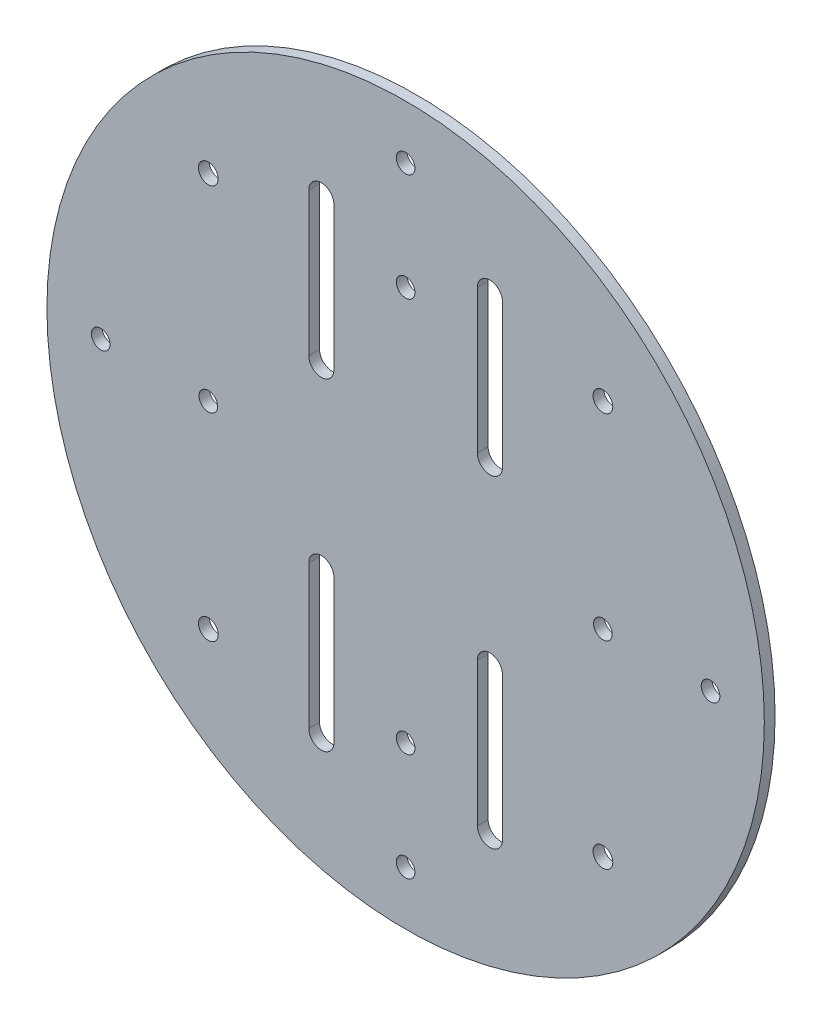
ISO-10303-21;
HEADER;
FILE_DESCRIPTION(('STEP AP214'),'2;1');
FILE_NAME('part.step','',(''),(''),'','','');
FILE_SCHEMA(('AUTOMOTIVE_DESIGN { 1 0 10303 214 1 1 1 1 }'));
ENDSEC;
DATA;
#1=APPLICATION_CONTEXT('core data for automotive mechanical design processes');
#2=APPLICATION_PROTOCOL_DEFINITION('international standard','automotive_design',2000,#1);
#3=PRODUCT_CONTEXT('',#1,'mechanical');
#4=PRODUCT('Part','Part','',(#3));
#5=PRODUCT_RELATED_PRODUCT_CATEGORY('part','',(#4));
#6=PRODUCT_DEFINITION_FORMATION('','',#4);
#7=PRODUCT_DEFINITION_CONTEXT('part definition',#1,'design');
#8=PRODUCT_DEFINITION('design','',#6,#7);
#9=PRODUCT_DEFINITION_SHAPE('','',#8);
#10=(LENGTH_UNIT() NAMED_UNIT(*) SI_UNIT(.MILLI.,.METRE.));
#11=(NAMED_UNIT(*) PLANE_ANGLE_UNIT() SI_UNIT($,.RADIAN.));
#12=(NAMED_UNIT(*) SI_UNIT($,.STERADIAN.) SOLID_ANGLE_UNIT());
#13=UNCERTAINTY_MEASURE_WITH_UNIT(LENGTH_MEASURE(1.E-05),#10,'distance_accuracy_value','');
#14=(GEOMETRIC_REPRESENTATION_CONTEXT(3) GLOBAL_UNCERTAINTY_ASSIGNED_CONTEXT((#13)) GLOBAL_UNIT_ASSIGNED_CONTEXT((#10,
#11,#12)) REPRESENTATION_CONTEXT('',''));
#15=CARTESIAN_POINT('',(0.,0.,0.));
#16=DIRECTION('',(0.,0.,1.));
#17=DIRECTION('',(1.,0.,0.));
#18=AXIS2_PLACEMENT_3D('',#15,#16,#17);
#19=CARTESIAN_POINT('',(0.,0.,30.));
#20=DIRECTION('',(0.,0.,-1.));
#21=DIRECTION('',(-1.,0.,0.));
#22=AXIS2_PLACEMENT_3D('',#19,#20,#21);
#23=CYLINDRICAL_SURFACE('',#22,100.);
#24=CARTESIAN_POINT('',(0.,0.,0.));
#25=DIRECTION('',(0.,0.,1.));
#26=DIRECTION('',(1.,0.,0.));
#27=AXIS2_PLACEMENT_3D('',#24,#25,#26);
#28=CIRCLE('',#27,100.);
#29=CARTESIAN_POINT('',(100.,0.,0.));
#30=VERTEX_POINT('',#29);
#31=EDGE_CURVE('E11',#30,#30,#28,.T.);
#32=ORIENTED_EDGE('',*,*,#31,.T.);
#33=EDGE_LOOP('',(#32));
#34=FACE_BOUND('',#33,.T.);
#35=CARTESIAN_POINT('',(0.,0.,3.));
#36=DIRECTION('',(0.,0.,1.));
#37=DIRECTION('',(1.,0.,0.));
#38=AXIS2_PLACEMENT_3D('',#35,#36,#37);
#39=CIRCLE('',#38,100.);
#40=CARTESIAN_POINT('',(100.,0.,3.));
#41=VERTEX_POINT('',#40);
#42=EDGE_CURVE('E290',#41,#41,#39,.T.);
#43=ORIENTED_EDGE('',*,*,#42,.F.);
#44=EDGE_LOOP('',(#43));
#45=FACE_BOUND('',#44,.T.);
#46=ADVANCED_FACE('F33',(#34,#45),#23,.T.);
#47=CARTESIAN_POINT('',(0.,-85.,30.));
#48=DIRECTION('',(0.,0.,1.));
#49=DIRECTION('',(1.,0.,0.));
#50=AXIS2_PLACEMENT_3D('',#47,#48,#49);
#51=CYLINDRICAL_SURFACE('',#50,2.59999999999999);
#52=CARTESIAN_POINT('',(0.,-85.,0.));
#53=DIRECTION('',(0.,0.,1.));
#54=DIRECTION('',(1.,0.,0.));
#55=AXIS2_PLACEMENT_3D('',#52,#53,#54);
#56=CIRCLE('',#55,2.6);
#57=CARTESIAN_POINT('',(2.6,-85.,0.));
#58=VERTEX_POINT('',#57);
#59=EDGE_CURVE('E41',#58,#58,#56,.T.);
#60=ORIENTED_EDGE('',*,*,#59,.F.);
#61=EDGE_LOOP('',(#60));
#62=FACE_BOUND('',#61,.T.);
#63=CARTESIAN_POINT('',(0.,-85.,3.));
#64=DIRECTION('',(0.,0.,1.));
#65=DIRECTION('',(1.,0.,0.));
#66=AXIS2_PLACEMENT_3D('',#63,#64,#65);
#67=CIRCLE('',#66,2.59999999999999);
#68=CARTESIAN_POINT('',(2.59999999999999,-85.,3.));
#69=VERTEX_POINT('',#68);
#70=EDGE_CURVE('E288',#69,#69,#67,.F.);
#71=ORIENTED_EDGE('',*,*,#70,.F.);
#72=EDGE_LOOP('',(#71));
#73=FACE_BOUND('',#72,.T.);
#74=ADVANCED_FACE('F281',(#62,#73),#51,.F.);
#75=CARTESIAN_POINT('',(0.,-55.,30.));
#76=DIRECTION('',(0.,0.,1.));
#77=DIRECTION('',(1.,0.,0.));
#78=AXIS2_PLACEMENT_3D('',#75,#76,#77);
#79=CYLINDRICAL_SURFACE('',#78,2.59999999999999);
#80=CARTESIAN_POINT('',(0.,-55.,0.));
#81=DIRECTION('',(0.,0.,1.));
#82=DIRECTION('',(1.,0.,0.));
#83=AXIS2_PLACEMENT_3D('',#80,#81,#82);
#84=CIRCLE('',#83,2.6);
#85=CARTESIAN_POINT('',(2.6,-55.,0.));
#86=VERTEX_POINT('',#85);
#87=EDGE_CURVE('E272',#86,#86,#84,.T.);
#88=ORIENTED_EDGE('',*,*,#87,.F.);
#89=EDGE_LOOP('',(#88));
#90=FACE_BOUND('',#89,.T.);
#91=CARTESIAN_POINT('',(0.,-55.,3.));
#92=DIRECTION('',(0.,0.,1.));
#93=DIRECTION('',(1.,0.,0.));
#94=AXIS2_PLACEMENT_3D('',#91,#92,#93);
#95=CIRCLE('',#94,2.59999999999999);
#96=CARTESIAN_POINT('',(2.59999999999999,-55.,3.));
#97=VERTEX_POINT('',#96);
#98=EDGE_CURVE('E291',#97,#97,#95,.F.);
#99=ORIENTED_EDGE('',*,*,#98,.F.);
#100=EDGE_LOOP('',(#99));
#101=FACE_BOUND('',#100,.T.);
#102=ADVANCED_FACE('F284',(#90,#101),#79,.F.);
#103=CARTESIAN_POINT('',(85.,0.,30.));
#104=DIRECTION('',(0.,0.,1.));
#105=DIRECTION('',(1.,0.,0.));
#106=AXIS2_PLACEMENT_3D('',#103,#104,#105);
#107=CYLINDRICAL_SURFACE('',#106,2.59999999999999);
#108=CARTESIAN_POINT('',(85.,0.,0.));
#109=DIRECTION('',(0.,0.,1.));
#110=DIRECTION('',(1.,0.,0.));
#111=AXIS2_PLACEMENT_3D('',#108,#109,#110);
#112=CIRCLE('',#111,2.59999999999999);
#113=CARTESIAN_POINT('',(87.6,0.,0.));
#114=VERTEX_POINT('',#113);
#115=EDGE_CURVE('E269',#114,#114,#112,.T.);
#116=ORIENTED_EDGE('',*,*,#115,.F.);
#117=EDGE_LOOP('',(#116));
#118=FACE_BOUND('',#117,.T.);
#119=CARTESIAN_POINT('',(85.,0.,3.));
#120=DIRECTION('',(0.,0.,1.));
#121=DIRECTION('',(1.,0.,0.));
#122=AXIS2_PLACEMENT_3D('',#119,#120,#121);
#123=CIRCLE('',#122,2.59999999999999);
#124=CARTESIAN_POINT('',(87.6,0.,3.));
#125=VERTEX_POINT('',#124);
#126=EDGE_CURVE('E297',#125,#125,#123,.F.);
#127=ORIENTED_EDGE('',*,*,#126,.F.);
#128=EDGE_LOOP('',(#127));
#129=FACE_BOUND('',#128,.T.);
#130=ADVANCED_FACE('F367',(#118,#129),#107,.F.);
#131=CARTESIAN_POINT('',(55.,0.,30.));
#132=DIRECTION('',(0.,0.,1.));
#133=DIRECTION('',(1.,0.,0.));
#134=AXIS2_PLACEMENT_3D('',#131,#132,#133);
#135=CYLINDRICAL_SURFACE('',#134,2.59999999999999);
#136=CARTESIAN_POINT('',(55.,0.,0.));
#137=DIRECTION('',(0.,0.,1.));
#138=DIRECTION('',(1.,0.,0.));
#139=AXIS2_PLACEMENT_3D('',#136,#137,#138);
#140=CIRCLE('',#139,2.6);
#141=CARTESIAN_POINT('',(57.6,0.,0.));
#142=VERTEX_POINT('',#141);
#143=EDGE_CURVE('E266',#142,#142,#140,.T.);
#144=ORIENTED_EDGE('',*,*,#143,.F.);
#145=EDGE_LOOP('',(#144));
#146=FACE_BOUND('',#145,.T.);
#147=CARTESIAN_POINT('',(55.,0.,3.));
#148=DIRECTION('',(0.,0.,1.));
#149=DIRECTION('',(1.,0.,0.));
#150=AXIS2_PLACEMENT_3D('',#147,#148,#149);
#151=CIRCLE('',#150,2.59999999999999);
#152=CARTESIAN_POINT('',(57.6,0.,3.));
#153=VERTEX_POINT('',#152);
#154=EDGE_CURVE('E360',#153,#153,#151,.F.);
#155=ORIENTED_EDGE('',*,*,#154,.F.);
#156=EDGE_LOOP('',(#155));
#157=FACE_BOUND('',#156,.T.);
#158=ADVANCED_FACE('F369',(#146,#157),#135,.F.);
#159=CARTESIAN_POINT('',(0.,85.,30.));
#160=DIRECTION('',(0.,0.,1.));
#161=DIRECTION('',(1.,0.,0.));
#162=AXIS2_PLACEMENT_3D('',#159,#160,#161);
#163=CYLINDRICAL_SURFACE('',#162,2.59999999999999);
#164=CARTESIAN_POINT('',(0.,85.,0.));
#165=DIRECTION('',(0.,0.,1.));
#166=DIRECTION('',(1.,0.,0.));
#167=AXIS2_PLACEMENT_3D('',#164,#165,#166);
#168=CIRCLE('',#167,2.6);
#169=CARTESIAN_POINT('',(2.6,85.,0.));
#170=VERTEX_POINT('',#169);
#171=EDGE_CURVE('E263',#170,#170,#168,.T.);
#172=ORIENTED_EDGE('',*,*,#171,.F.);
#173=EDGE_LOOP('',(#172));
#174=FACE_BOUND('',#173,.T.);
#175=CARTESIAN_POINT('',(0.,85.,3.));
#176=DIRECTION('',(0.,0.,1.));
#177=DIRECTION('',(1.,0.,0.));
#178=AXIS2_PLACEMENT_3D('',#175,#176,#177);
#179=CIRCLE('',#178,2.59999999999999);
#180=CARTESIAN_POINT('',(2.59999999999999,85.,3.));
#181=VERTEX_POINT('',#180);
#182=EDGE_CURVE('E357',#181,#181,#179,.F.);
#183=ORIENTED_EDGE('',*,*,#182,.F.);
#184=EDGE_LOOP('',(#183));
#185=FACE_BOUND('',#184,.T.);
#186=ADVANCED_FACE('F376',(#174,#185),#163,.F.);
#187=CARTESIAN_POINT('',(0.,55.,30.));
#188=DIRECTION('',(0.,0.,1.));
#189=DIRECTION('',(1.,0.,0.));
#190=AXIS2_PLACEMENT_3D('',#187,#188,#189);
#191=CYLINDRICAL_SURFACE('',#190,2.59999999999999);
#192=CARTESIAN_POINT('',(0.,55.,0.));
#193=DIRECTION('',(0.,0.,1.));
#194=DIRECTION('',(1.,0.,0.));
#195=AXIS2_PLACEMENT_3D('',#192,#193,#194);
#196=CIRCLE('',#195,2.6);
#197=CARTESIAN_POINT('',(2.6,55.,0.));
#198=VERTEX_POINT('',#197);
#199=EDGE_CURVE('E260',#198,#198,#196,.T.);
#200=ORIENTED_EDGE('',*,*,#199,.F.);
#201=EDGE_LOOP('',(#200));
#202=FACE_BOUND('',#201,.T.);
#203=CARTESIAN_POINT('',(0.,55.,3.));
#204=DIRECTION('',(0.,0.,1.));
#205=DIRECTION('',(1.,0.,0.));
#206=AXIS2_PLACEMENT_3D('',#203,#204,#205);
#207=CIRCLE('',#206,2.59999999999999);
#208=CARTESIAN_POINT('',(2.59999999999999,55.,3.));
#209=VERTEX_POINT('',#208);
#210=EDGE_CURVE('E354',#209,#209,#207,.F.);
#211=ORIENTED_EDGE('',*,*,#210,.F.);
#212=EDGE_LOOP('',(#211));
#213=FACE_BOUND('',#212,.T.);
#214=ADVANCED_FACE('F476',(#202,#213),#191,.F.);
#215=CARTESIAN_POINT('',(-55.,0.,30.));
#216=DIRECTION('',(0.,0.,1.));
#217=DIRECTION('',(1.,0.,0.));
#218=AXIS2_PLACEMENT_3D('',#215,#216,#217);
#219=CYLINDRICAL_SURFACE('',#218,2.59999999999999);
#220=CARTESIAN_POINT('',(-55.,0.,0.));
#221=DIRECTION('',(0.,0.,1.));
#222=DIRECTION('',(1.,0.,0.));
#223=AXIS2_PLACEMENT_3D('',#220,#221,#222);
#224=CIRCLE('',#223,2.6);
#225=CARTESIAN_POINT('',(-52.4,0.,0.));
#226=VERTEX_POINT('',#225);
#227=EDGE_CURVE('E257',#226,#226,#224,.T.);
#228=ORIENTED_EDGE('',*,*,#227,.F.);
#229=EDGE_LOOP('',(#228));
#230=FACE_BOUND('',#229,.T.);
#231=CARTESIAN_POINT('',(-55.,0.,3.));
#232=DIRECTION('',(0.,0.,1.));
#233=DIRECTION('',(1.,0.,0.));
#234=AXIS2_PLACEMENT_3D('',#231,#232,#233);
#235=CIRCLE('',#234,2.59999999999999);
#236=CARTESIAN_POINT('',(-52.4,0.,3.));
#237=VERTEX_POINT('',#236);
#238=EDGE_CURVE('E351',#237,#237,#235,.F.);
#239=ORIENTED_EDGE('',*,*,#238,.F.);
#240=EDGE_LOOP('',(#239));
#241=FACE_BOUND('',#240,.T.);
#242=ADVANCED_FACE('F472',(#230,#241),#219,.F.);
#243=CARTESIAN_POINT('',(-85.,0.,30.));
#244=DIRECTION('',(0.,0.,1.));
#245=DIRECTION('',(1.,0.,0.));
#246=AXIS2_PLACEMENT_3D('',#243,#244,#245);
#247=CYLINDRICAL_SURFACE('',#246,2.59999999999999);
#248=CARTESIAN_POINT('',(-85.,0.,0.));
#249=DIRECTION('',(0.,0.,1.));
#250=DIRECTION('',(1.,0.,0.));
#251=AXIS2_PLACEMENT_3D('',#248,#249,#250);
#252=CIRCLE('',#251,2.59999999999999);
#253=CARTESIAN_POINT('',(-82.4,0.,0.));
#254=VERTEX_POINT('',#253);
#255=EDGE_CURVE('E246',#254,#254,#252,.T.);
#256=ORIENTED_EDGE('',*,*,#255,.F.);
#257=EDGE_LOOP('',(#256));
#258=FACE_BOUND('',#257,.T.);
#259=CARTESIAN_POINT('',(-85.,0.,3.));
#260=DIRECTION('',(0.,0.,1.));
#261=DIRECTION('',(1.,0.,0.));
#262=AXIS2_PLACEMENT_3D('',#259,#260,#261);
#263=CIRCLE('',#262,2.59999999999999);
#264=CARTESIAN_POINT('',(-82.4,0.,3.));
#265=VERTEX_POINT('',#264);
#266=EDGE_CURVE('E348',#265,#265,#263,.F.);
#267=ORIENTED_EDGE('',*,*,#266,.F.);
#268=EDGE_LOOP('',(#267));
#269=FACE_BOUND('',#268,.T.);
#270=ADVANCED_FACE('F468',(#258,#269),#247,.F.);
#271=CARTESIAN_POINT('',(23.5,65.,0.));
#272=DIRECTION('',(0.,0.,1.));
#273=DIRECTION('',(1.,0.,0.));
#274=AXIS2_PLACEMENT_3D('',#271,#272,#273);
#275=CYLINDRICAL_SURFACE('',#274,3.5);
#276=CARTESIAN_POINT('',(23.5,65.,3.));
#277=DIRECTION('',(0.,0.,1.));
#278=DIRECTION('',(1.,0.,0.));
#279=AXIS2_PLACEMENT_3D('',#276,#277,#278);
#280=CIRCLE('',#279,3.5);
#281=CARTESIAN_POINT('',(20.,65.,3.));
#282=VERTEX_POINT('',#281);
#283=CARTESIAN_POINT('',(27.,65.,3.));
#284=VERTEX_POINT('',#283);
#285=EDGE_CURVE('E346',#282,#284,#280,.F.);
#286=ORIENTED_EDGE('',*,*,#285,.F.);
#287=DIRECTION('',(0.,0.,1.));
#288=VECTOR('',#287,1.);
#289=CARTESIAN_POINT('',(20.,65.,0.));
#290=LINE('',#289,#288);
#291=CARTESIAN_POINT('',(20.,65.,0.));
#292=VERTEX_POINT('',#291);
#293=EDGE_CURVE('E242',#292,#282,#290,.T.);
#294=ORIENTED_EDGE('',*,*,#293,.F.);
#295=CARTESIAN_POINT('',(23.5,65.,0.));
#296=DIRECTION('',(0.,0.,1.));
#297=DIRECTION('',(1.,0.,0.));
#298=AXIS2_PLACEMENT_3D('',#295,#296,#297);
#299=CIRCLE('',#298,3.5);
#300=CARTESIAN_POINT('',(27.,65.,0.));
#301=VERTEX_POINT('',#300);
#302=EDGE_CURVE('E222',#301,#292,#299,.T.);
#303=ORIENTED_EDGE('',*,*,#302,.F.);
#304=DIRECTION('',(0.,0.,1.));
#305=VECTOR('',#304,1.);
#306=CARTESIAN_POINT('',(27.,65.,0.));
#307=LINE('',#306,#305);
#308=EDGE_CURVE('E243',#301,#284,#307,.T.);
#309=ORIENTED_EDGE('',*,*,#308,.T.);
#310=EDGE_LOOP('',(#286,#294,#303,#309));
#311=FACE_BOUND('',#310,.T.);
#312=ADVANCED_FACE('F458',(#311),#275,.F.);
#313=CARTESIAN_POINT('',(27.,65.,0.));
#314=DIRECTION('',(1.,0.,0.));
#315=DIRECTION('',(0.,1.,0.));
#316=AXIS2_PLACEMENT_3D('',#313,#314,#315);
#317=PLANE('',#316);
#318=DIRECTION('',(0.,-1.,0.));
#319=VECTOR('',#318,1.);
#320=CARTESIAN_POINT('',(27.,65.,3.));
#321=LINE('',#320,#319);
#322=CARTESIAN_POINT('',(27.,25.,3.));
#323=VERTEX_POINT('',#322);
#324=EDGE_CURVE('E344',#284,#323,#321,.T.);
#325=ORIENTED_EDGE('',*,*,#324,.F.);
#326=ORIENTED_EDGE('',*,*,#308,.F.);
#327=DIRECTION('',(0.,1.,0.));
#328=VECTOR('',#327,1.);
#329=CARTESIAN_POINT('',(27.,65.,0.));
#330=LINE('',#329,#328);
#331=CARTESIAN_POINT('',(27.,25.,0.));
#332=VERTEX_POINT('',#331);
#333=EDGE_CURVE('E239',#332,#301,#330,.T.);
#334=ORIENTED_EDGE('',*,*,#333,.F.);
#335=DIRECTION('',(0.,0.,1.));
#336=VECTOR('',#335,1.);
#337=CARTESIAN_POINT('',(27.,25.,0.));
#338=LINE('',#337,#336);
#339=EDGE_CURVE('E247',#332,#323,#338,.T.);
#340=ORIENTED_EDGE('',*,*,#339,.T.);
#341=EDGE_LOOP('',(#325,#326,#334,#340));
#342=FACE_BOUND('',#341,.T.);
#343=ADVANCED_FACE('F454',(#342),#317,.F.);
#344=CARTESIAN_POINT('',(23.5,25.,0.));
#345=DIRECTION('',(0.,0.,1.));
#346=DIRECTION('',(1.,0.,0.));
#347=AXIS2_PLACEMENT_3D('',#344,#345,#346);
#348=CYLINDRICAL_SURFACE('',#347,3.5);
#349=CARTESIAN_POINT('',(23.5,25.,3.));
#350=DIRECTION('',(0.,0.,1.));
#351=DIRECTION('',(1.,0.,0.));
#352=AXIS2_PLACEMENT_3D('',#349,#350,#351);
#353=CIRCLE('',#352,3.5);
#354=CARTESIAN_POINT('',(20.,25.,3.));
#355=VERTEX_POINT('',#354);
#356=EDGE_CURVE('E48',#323,#355,#353,.F.);
#357=ORIENTED_EDGE('',*,*,#356,.F.);
#358=ORIENTED_EDGE('',*,*,#339,.F.);
#359=CARTESIAN_POINT('',(23.5,25.,0.));
#360=DIRECTION('',(0.,0.,1.));
#361=DIRECTION('',(1.,0.,0.));
#362=AXIS2_PLACEMENT_3D('',#359,#360,#361);
#363=CIRCLE('',#362,3.5);
#364=CARTESIAN_POINT('',(20.,25.,0.));
#365=VERTEX_POINT('',#364);
#366=EDGE_CURVE('E236',#365,#332,#363,.T.);
#367=ORIENTED_EDGE('',*,*,#366,.F.);
#368=DIRECTION('',(0.,0.,1.));
#369=VECTOR('',#368,1.);
#370=CARTESIAN_POINT('',(20.,25.,0.));
#371=LINE('',#370,#369);
#372=EDGE_CURVE('E250',#365,#355,#371,.T.);
#373=ORIENTED_EDGE('',*,*,#372,.T.);
#374=EDGE_LOOP('',(#357,#358,#367,#373));
#375=FACE_BOUND('',#374,.T.);
#376=ADVANCED_FACE('F457',(#375),#348,.F.);
#377=CARTESIAN_POINT('',(20.,65.,0.));
#378=DIRECTION('',(-1.,0.,0.));
#379=DIRECTION('',(0.,-1.,0.));
#380=AXIS2_PLACEMENT_3D('',#377,#378,#379);
#381=PLANE('',#380);
#382=DIRECTION('',(0.,1.,0.));
#383=VECTOR('',#382,1.);
#384=CARTESIAN_POINT('',(20.,65.,3.));
#385=LINE('',#384,#383);
#386=EDGE_CURVE('E341',#355,#282,#385,.T.);
#387=ORIENTED_EDGE('',*,*,#386,.F.);
#388=ORIENTED_EDGE('',*,*,#372,.F.);
#389=DIRECTION('',(0.,-1.,0.));
#390=VECTOR('',#389,1.);
#391=CARTESIAN_POINT('',(20.,65.,0.));
#392=LINE('',#391,#390);
#393=EDGE_CURVE('E233',#292,#365,#392,.T.);
#394=ORIENTED_EDGE('',*,*,#393,.F.);
#395=ORIENTED_EDGE('',*,*,#293,.T.);
#396=EDGE_LOOP('',(#387,#388,#394,#395));
#397=FACE_BOUND('',#396,.T.);
#398=ADVANCED_FACE('F452',(#397),#381,.F.);
#399=CARTESIAN_POINT('',(-23.5,65.,0.));
#400=DIRECTION('',(0.,0.,1.));
#401=DIRECTION('',(1.,0.,0.));
#402=AXIS2_PLACEMENT_3D('',#399,#400,#401);
#403=CYLINDRICAL_SURFACE('',#402,3.5);
#404=CARTESIAN_POINT('',(-23.5,65.,3.));
#405=DIRECTION('',(0.,0.,1.));
#406=DIRECTION('',(1.,0.,0.));
#407=AXIS2_PLACEMENT_3D('',#404,#405,#406);
#408=CIRCLE('',#407,3.5);
#409=CARTESIAN_POINT('',(-27.,65.,3.));
#410=VERTEX_POINT('',#409);
#411=CARTESIAN_POINT('',(-20.,65.,3.));
#412=VERTEX_POINT('',#411);
#413=EDGE_CURVE('E339',#410,#412,#408,.F.);
#414=ORIENTED_EDGE('',*,*,#413,.F.);
#415=DIRECTION('',(0.,0.,1.));
#416=VECTOR('',#415,1.);
#417=CARTESIAN_POINT('',(-27.,65.,0.));
#418=LINE('',#417,#416);
#419=CARTESIAN_POINT('',(-27.,65.,0.));
#420=VERTEX_POINT('',#419);
#421=EDGE_CURVE('E218',#420,#410,#418,.T.);
#422=ORIENTED_EDGE('',*,*,#421,.F.);
#423=CARTESIAN_POINT('',(-23.5,65.,0.));
#424=DIRECTION('',(0.,0.,1.));
#425=DIRECTION('',(1.,0.,0.));
#426=AXIS2_PLACEMENT_3D('',#423,#424,#425);
#427=CIRCLE('',#426,3.5);
#428=CARTESIAN_POINT('',(-20.,65.,0.));
#429=VERTEX_POINT('',#428);
#430=EDGE_CURVE('E198',#429,#420,#427,.T.);
#431=ORIENTED_EDGE('',*,*,#430,.F.);
#432=DIRECTION('',(0.,0.,1.));
#433=VECTOR('',#432,1.);
#434=CARTESIAN_POINT('',(-20.,65.,0.));
#435=LINE('',#434,#433);
#436=EDGE_CURVE('E219',#429,#412,#435,.T.);
#437=ORIENTED_EDGE('',*,*,#436,.T.);
#438=EDGE_LOOP('',(#414,#422,#431,#437));
#439=FACE_BOUND('',#438,.T.);
#440=ADVANCED_FACE('F442',(#439),#403,.F.);
#441=CARTESIAN_POINT('',(-20.,65.,0.));
#442=DIRECTION('',(1.,0.,0.));
#443=DIRECTION('',(0.,1.,0.));
#444=AXIS2_PLACEMENT_3D('',#441,#442,#443);
#445=PLANE('',#444);
#446=DIRECTION('',(0.,-1.,0.));
#447=VECTOR('',#446,1.);
#448=CARTESIAN_POINT('',(-20.,65.,3.));
#449=LINE('',#448,#447);
#450=CARTESIAN_POINT('',(-20.,25.,3.));
#451=VERTEX_POINT('',#450);
#452=EDGE_CURVE('E337',#412,#451,#449,.T.);
#453=ORIENTED_EDGE('',*,*,#452,.F.);
#454=ORIENTED_EDGE('',*,*,#436,.F.);
#455=DIRECTION('',(0.,1.,0.));
#456=VECTOR('',#455,1.);
#457=CARTESIAN_POINT('',(-20.,65.,0.));
#458=LINE('',#457,#456);
#459=CARTESIAN_POINT('',(-20.,25.,0.));
#460=VERTEX_POINT('',#459);
#461=EDGE_CURVE('E215',#460,#429,#458,.T.);
#462=ORIENTED_EDGE('',*,*,#461,.F.);
#463=DIRECTION('',(0.,0.,1.));
#464=VECTOR('',#463,1.);
#465=CARTESIAN_POINT('',(-20.,25.,0.));
#466=LINE('',#465,#464);
#467=EDGE_CURVE('E223',#460,#451,#466,.T.);
#468=ORIENTED_EDGE('',*,*,#467,.T.);
#469=EDGE_LOOP('',(#453,#454,#462,#468));
#470=FACE_BOUND('',#469,.T.);
#471=ADVANCED_FACE('F438',(#470),#445,.F.);
#472=CARTESIAN_POINT('',(-23.5,25.,0.));
#473=DIRECTION('',(0.,0.,1.));
#474=DIRECTION('',(1.,0.,0.));
#475=AXIS2_PLACEMENT_3D('',#472,#473,#474);
#476=CYLINDRICAL_SURFACE('',#475,3.5);
#477=CARTESIAN_POINT('',(-23.5,25.,3.));
#478=DIRECTION('',(0.,0.,1.));
#479=DIRECTION('',(1.,0.,0.));
#480=AXIS2_PLACEMENT_3D('',#477,#478,#479);
#481=CIRCLE('',#480,3.5);
#482=CARTESIAN_POINT('',(-27.,25.,3.));
#483=VERTEX_POINT('',#482);
#484=EDGE_CURVE('E56',#451,#483,#481,.F.);
#485=ORIENTED_EDGE('',*,*,#484,.F.);
#486=ORIENTED_EDGE('',*,*,#467,.F.);
#487=CARTESIAN_POINT('',(-23.5,25.,0.));
#488=DIRECTION('',(0.,0.,1.));
#489=DIRECTION('',(1.,0.,0.));
#490=AXIS2_PLACEMENT_3D('',#487,#488,#489);
#491=CIRCLE('',#490,3.5);
#492=CARTESIAN_POINT('',(-27.,25.,0.));
#493=VERTEX_POINT('',#492);
#494=EDGE_CURVE('E212',#493,#460,#491,.T.);
#495=ORIENTED_EDGE('',*,*,#494,.F.);
#496=DIRECTION('',(0.,0.,1.));
#497=VECTOR('',#496,1.);
#498=CARTESIAN_POINT('',(-27.,25.,0.));
#499=LINE('',#498,#497);
#500=EDGE_CURVE('E226',#493,#483,#499,.T.);
#501=ORIENTED_EDGE('',*,*,#500,.T.);
#502=EDGE_LOOP('',(#485,#486,#495,#501));
#503=FACE_BOUND('',#502,.T.);
#504=ADVANCED_FACE('F441',(#503),#476,.F.);
#505=CARTESIAN_POINT('',(-27.,65.,0.));
#506=DIRECTION('',(-1.,0.,0.));
#507=DIRECTION('',(0.,-1.,0.));
#508=AXIS2_PLACEMENT_3D('',#505,#506,#507);
#509=PLANE('',#508);
#510=DIRECTION('',(0.,1.,0.));
#511=VECTOR('',#510,1.);
#512=CARTESIAN_POINT('',(-27.,65.,3.));
#513=LINE('',#512,#511);
#514=EDGE_CURVE('E334',#483,#410,#513,.T.);
#515=ORIENTED_EDGE('',*,*,#514,.F.);
#516=ORIENTED_EDGE('',*,*,#500,.F.);
#517=DIRECTION('',(0.,-1.,0.));
#518=VECTOR('',#517,1.);
#519=CARTESIAN_POINT('',(-27.,65.,0.));
#520=LINE('',#519,#518);
#521=EDGE_CURVE('E209',#420,#493,#520,.T.);
#522=ORIENTED_EDGE('',*,*,#521,.F.);
#523=ORIENTED_EDGE('',*,*,#421,.T.);
#524=EDGE_LOOP('',(#515,#516,#522,#523));
#525=FACE_BOUND('',#524,.T.);
#526=ADVANCED_FACE('F436',(#525),#509,.F.);
#527=CARTESIAN_POINT('',(-23.5,-25.,0.));
#528=DIRECTION('',(0.,0.,1.));
#529=DIRECTION('',(1.,0.,0.));
#530=AXIS2_PLACEMENT_3D('',#527,#528,#529);
#531=CYLINDRICAL_SURFACE('',#530,3.5);
#532=CARTESIAN_POINT('',(-23.5,-25.,3.));
#533=DIRECTION('',(0.,0.,1.));
#534=DIRECTION('',(1.,0.,0.));
#535=AXIS2_PLACEMENT_3D('',#532,#533,#534);
#536=CIRCLE('',#535,3.5);
#537=CARTESIAN_POINT('',(-27.,-25.,3.));
#538=VERTEX_POINT('',#537);
#539=CARTESIAN_POINT('',(-20.,-25.,3.));
#540=VERTEX_POINT('',#539);
#541=EDGE_CURVE('E332',#538,#540,#536,.F.);
#542=ORIENTED_EDGE('',*,*,#541,.F.);
#543=DIRECTION('',(0.,0.,1.));
#544=VECTOR('',#543,1.);
#545=CARTESIAN_POINT('',(-27.,-25.,0.));
#546=LINE('',#545,#544);
#547=CARTESIAN_POINT('',(-27.,-25.,0.));
#548=VERTEX_POINT('',#547);
#549=EDGE_CURVE('E194',#548,#538,#546,.T.);
#550=ORIENTED_EDGE('',*,*,#549,.F.);
#551=CARTESIAN_POINT('',(-23.5,-25.,0.));
#552=DIRECTION('',(0.,0.,1.));
#553=DIRECTION('',(1.,0.,0.));
#554=AXIS2_PLACEMENT_3D('',#551,#552,#553);
#555=CIRCLE('',#554,3.5);
#556=CARTESIAN_POINT('',(-20.,-25.,0.));
#557=VERTEX_POINT('',#556);
#558=EDGE_CURVE('E182',#557,#548,#555,.T.);
#559=ORIENTED_EDGE('',*,*,#558,.F.);
#560=DIRECTION('',(0.,0.,1.));
#561=VECTOR('',#560,1.);
#562=CARTESIAN_POINT('',(-20.,-25.,0.));
#563=LINE('',#562,#561);
#564=EDGE_CURVE('E195',#557,#540,#563,.T.);
#565=ORIENTED_EDGE('',*,*,#564,.T.);
#566=EDGE_LOOP('',(#542,#550,#559,#565));
#567=FACE_BOUND('',#566,.T.);
#568=ADVANCED_FACE('F426',(#567),#531,.F.);
#569=CARTESIAN_POINT('',(-20.,-25.,0.));
#570=DIRECTION('',(1.,0.,0.));
#571=DIRECTION('',(0.,1.,0.));
#572=AXIS2_PLACEMENT_3D('',#569,#570,#571);
#573=PLANE('',#572);
#574=DIRECTION('',(0.,-1.,0.));
#575=VECTOR('',#574,1.);
#576=CARTESIAN_POINT('',(-20.,-25.,3.));
#577=LINE('',#576,#575);
#578=CARTESIAN_POINT('',(-20.,-65.,3.));
#579=VERTEX_POINT('',#578);
#580=EDGE_CURVE('E330',#540,#579,#577,.T.);
#581=ORIENTED_EDGE('',*,*,#580,.F.);
#582=ORIENTED_EDGE('',*,*,#564,.F.);
#583=DIRECTION('',(0.,1.,0.));
#584=VECTOR('',#583,1.);
#585=CARTESIAN_POINT('',(-20.,-25.,0.));
#586=LINE('',#585,#584);
#587=CARTESIAN_POINT('',(-20.,-65.,0.));
#588=VERTEX_POINT('',#587);
#589=EDGE_CURVE('E191',#588,#557,#586,.T.);
#590=ORIENTED_EDGE('',*,*,#589,.F.);
#591=DIRECTION('',(0.,0.,1.));
#592=VECTOR('',#591,1.);
#593=CARTESIAN_POINT('',(-20.,-65.,0.));
#594=LINE('',#593,#592);
#595=EDGE_CURVE('E199',#588,#579,#594,.T.);
#596=ORIENTED_EDGE('',*,*,#595,.T.);
#597=EDGE_LOOP('',(#581,#582,#590,#596));
#598=FACE_BOUND('',#597,.T.);
#599=ADVANCED_FACE('F422',(#598),#573,.F.);
#600=CARTESIAN_POINT('',(-23.5,-65.,0.));
#601=DIRECTION('',(0.,0.,1.));
#602=DIRECTION('',(1.,0.,0.));
#603=AXIS2_PLACEMENT_3D('',#600,#601,#602);
#604=CYLINDRICAL_SURFACE('',#603,3.5);
#605=CARTESIAN_POINT('',(-23.5,-65.,3.));
#606=DIRECTION('',(0.,0.,1.));
#607=DIRECTION('',(1.,0.,0.));
#608=AXIS2_PLACEMENT_3D('',#605,#606,#607);
#609=CIRCLE('',#608,3.5);
#610=CARTESIAN_POINT('',(-27.,-65.,3.));
#611=VERTEX_POINT('',#610);
#612=EDGE_CURVE('E328',#579,#611,#609,.F.);
#613=ORIENTED_EDGE('',*,*,#612,.F.);
#614=ORIENTED_EDGE('',*,*,#595,.F.);
#615=CARTESIAN_POINT('',(-23.5,-65.,0.));
#616=DIRECTION('',(0.,0.,1.));
#617=DIRECTION('',(1.,0.,0.));
#618=AXIS2_PLACEMENT_3D('',#615,#616,#617);
#619=CIRCLE('',#618,3.5);
#620=CARTESIAN_POINT('',(-27.,-65.,0.));
#621=VERTEX_POINT('',#620);
#622=EDGE_CURVE('E188',#621,#588,#619,.T.);
#623=ORIENTED_EDGE('',*,*,#622,.F.);
#624=DIRECTION('',(0.,0.,1.));
#625=VECTOR('',#624,1.);
#626=CARTESIAN_POINT('',(-27.,-65.,0.));
#627=LINE('',#626,#625);
#628=EDGE_CURVE('E202',#621,#611,#627,.T.);
#629=ORIENTED_EDGE('',*,*,#628,.T.);
#630=EDGE_LOOP('',(#613,#614,#623,#629));
#631=FACE_BOUND('',#630,.T.);
#632=ADVANCED_FACE('F425',(#631),#604,.F.);
#633=CARTESIAN_POINT('',(-27.,-25.,0.));
#634=DIRECTION('',(-1.,0.,0.));
#635=DIRECTION('',(0.,-1.,0.));
#636=AXIS2_PLACEMENT_3D('',#633,#634,#635);
#637=PLANE('',#636);
#638=DIRECTION('',(0.,1.,0.));
#639=VECTOR('',#638,1.);
#640=CARTESIAN_POINT('',(-27.,-25.,3.));
#641=LINE('',#640,#639);
#642=EDGE_CURVE('E165',#611,#538,#641,.T.);
#643=ORIENTED_EDGE('',*,*,#642,.F.);
#644=ORIENTED_EDGE('',*,*,#628,.F.);
#645=DIRECTION('',(0.,-1.,0.));
#646=VECTOR('',#645,1.);
#647=CARTESIAN_POINT('',(-27.,-25.,0.));
#648=LINE('',#647,#646);
#649=EDGE_CURVE('E185',#548,#621,#648,.T.);
#650=ORIENTED_EDGE('',*,*,#649,.F.);
#651=ORIENTED_EDGE('',*,*,#549,.T.);
#652=EDGE_LOOP('',(#643,#644,#650,#651));
#653=FACE_BOUND('',#652,.T.);
#654=ADVANCED_FACE('F421',(#653),#637,.F.);
#655=CARTESIAN_POINT('',(23.5,-65.,0.));
#656=DIRECTION('',(0.,0.,1.));
#657=DIRECTION('',(1.,0.,0.));
#658=AXIS2_PLACEMENT_3D('',#655,#656,#657);
#659=CYLINDRICAL_SURFACE('',#658,3.50000000000001);
#660=CARTESIAN_POINT('',(23.5,-65.,3.));
#661=DIRECTION('',(0.,0.,1.));
#662=DIRECTION('',(1.,0.,0.));
#663=AXIS2_PLACEMENT_3D('',#660,#661,#662);
#664=CIRCLE('',#663,3.50000000000001);
#665=CARTESIAN_POINT('',(27.,-65.,3.));
#666=VERTEX_POINT('',#665);
#667=CARTESIAN_POINT('',(20.,-65.,3.));
#668=VERTEX_POINT('',#667);
#669=EDGE_CURVE('E148',#666,#668,#664,.F.);
#670=ORIENTED_EDGE('',*,*,#669,.F.);
#671=DIRECTION('',(0.,0.,1.));
#672=VECTOR('',#671,1.);
#673=CARTESIAN_POINT('',(27.,-65.,0.));
#674=LINE('',#673,#672);
#675=CARTESIAN_POINT('',(27.,-65.,0.));
#676=VERTEX_POINT('',#675);
#677=EDGE_CURVE('E162',#676,#666,#674,.T.);
#678=ORIENTED_EDGE('',*,*,#677,.F.);
#679=CARTESIAN_POINT('',(23.5,-65.,0.));
#680=DIRECTION('',(0.,0.,1.));
#681=DIRECTION('',(1.,0.,0.));
#682=AXIS2_PLACEMENT_3D('',#679,#680,#681);
#683=CIRCLE('',#682,3.50000000000001);
#684=CARTESIAN_POINT('',(20.,-65.,0.));
#685=VERTEX_POINT('',#684);
#686=EDGE_CURVE('E312',#685,#676,#683,.T.);
#687=ORIENTED_EDGE('',*,*,#686,.F.);
#688=DIRECTION('',(0.,0.,1.));
#689=VECTOR('',#688,1.);
#690=CARTESIAN_POINT('',(20.,-65.,0.));
#691=LINE('',#690,#689);
#692=EDGE_CURVE('E164',#685,#668,#691,.T.);
#693=ORIENTED_EDGE('',*,*,#692,.T.);
#694=EDGE_LOOP('',(#670,#678,#687,#693));
#695=FACE_BOUND('',#694,.T.);
#696=ADVANCED_FACE('F160',(#695),#659,.F.);
#697=CARTESIAN_POINT('',(20.,-65.,0.));
#698=DIRECTION('',(-1.,0.,0.));
#699=DIRECTION('',(0.,-1.,0.));
#700=AXIS2_PLACEMENT_3D('',#697,#698,#699);
#701=PLANE('',#700);
#702=DIRECTION('',(0.,1.,0.));
#703=VECTOR('',#702,1.);
#704=CARTESIAN_POINT('',(20.,-65.,3.));
#705=LINE('',#704,#703);
#706=CARTESIAN_POINT('',(20.,-25.,3.));
#707=VERTEX_POINT('',#706);
#708=EDGE_CURVE('E166',#668,#707,#705,.T.);
#709=ORIENTED_EDGE('',*,*,#708,.F.);
#710=ORIENTED_EDGE('',*,*,#692,.F.);
#711=DIRECTION('',(0.,-1.,0.));
#712=VECTOR('',#711,1.);
#713=CARTESIAN_POINT('',(20.,-65.,0.));
#714=LINE('',#713,#712);
#715=CARTESIAN_POINT('',(20.,-25.,0.));
#716=VERTEX_POINT('',#715);
#717=EDGE_CURVE('E173',#716,#685,#714,.T.);
#718=ORIENTED_EDGE('',*,*,#717,.F.);
#719=DIRECTION('',(0.,0.,1.));
#720=VECTOR('',#719,1.);
#721=CARTESIAN_POINT('',(20.,-25.,0.));
#722=LINE('',#721,#720);
#723=EDGE_CURVE('E175',#716,#707,#722,.T.);
#724=ORIENTED_EDGE('',*,*,#723,.T.);
#725=EDGE_LOOP('',(#709,#710,#718,#724));
#726=FACE_BOUND('',#725,.T.);
#727=ADVANCED_FACE('F320',(#726),#701,.F.);
#728=CARTESIAN_POINT('',(23.5,-25.,0.));
#729=DIRECTION('',(0.,0.,1.));
#730=DIRECTION('',(1.,0.,0.));
#731=AXIS2_PLACEMENT_3D('',#728,#729,#730);
#732=CYLINDRICAL_SURFACE('',#731,3.50000000000001);
#733=CARTESIAN_POINT('',(23.5,-25.,3.));
#734=DIRECTION('',(0.,0.,1.));
#735=DIRECTION('',(1.,0.,0.));
#736=AXIS2_PLACEMENT_3D('',#733,#734,#735);
#737=CIRCLE('',#736,3.50000000000001);
#738=CARTESIAN_POINT('',(27.,-25.,3.));
#739=VERTEX_POINT('',#738);
#740=EDGE_CURVE('E151',#707,#739,#737,.F.);
#741=ORIENTED_EDGE('',*,*,#740,.F.);
#742=ORIENTED_EDGE('',*,*,#723,.F.);
#743=CARTESIAN_POINT('',(23.5,-25.,0.));
#744=DIRECTION('',(0.,0.,1.));
#745=DIRECTION('',(1.,0.,0.));
#746=AXIS2_PLACEMENT_3D('',#743,#744,#745);
#747=CIRCLE('',#746,3.50000000000001);
#748=CARTESIAN_POINT('',(27.,-25.,0.));
#749=VERTEX_POINT('',#748);
#750=EDGE_CURVE('E178',#749,#716,#747,.T.);
#751=ORIENTED_EDGE('',*,*,#750,.F.);
#752=DIRECTION('',(0.,0.,1.));
#753=VECTOR('',#752,1.);
#754=CARTESIAN_POINT('',(27.,-25.,0.));
#755=LINE('',#754,#753);
#756=EDGE_CURVE('E172',#749,#739,#755,.T.);
#757=ORIENTED_EDGE('',*,*,#756,.T.);
#758=EDGE_LOOP('',(#741,#742,#751,#757));
#759=FACE_BOUND('',#758,.T.);
#760=ADVANCED_FACE('F322',(#759),#732,.F.);
#761=CARTESIAN_POINT('',(27.,-65.,0.));
#762=DIRECTION('',(1.,0.,0.));
#763=DIRECTION('',(0.,1.,0.));
#764=AXIS2_PLACEMENT_3D('',#761,#762,#763);
#765=PLANE('',#764);
#766=DIRECTION('',(0.,-1.,0.));
#767=VECTOR('',#766,1.);
#768=CARTESIAN_POINT('',(27.,-65.,3.));
#769=LINE('',#768,#767);
#770=EDGE_CURVE('E145',#739,#666,#769,.T.);
#771=ORIENTED_EDGE('',*,*,#770,.F.);
#772=ORIENTED_EDGE('',*,*,#756,.F.);
#773=DIRECTION('',(0.,1.,0.));
#774=VECTOR('',#773,1.);
#775=CARTESIAN_POINT('',(27.,-65.,0.));
#776=LINE('',#775,#774);
#777=EDGE_CURVE('E170',#676,#749,#776,.T.);
#778=ORIENTED_EDGE('',*,*,#777,.F.);
#779=ORIENTED_EDGE('',*,*,#677,.T.);
#780=EDGE_LOOP('',(#771,#772,#778,#779));
#781=FACE_BOUND('',#780,.T.);
#782=ADVANCED_FACE('F168',(#781),#765,.F.);
#783=CARTESIAN_POINT('',(-55.,-55.,30.));
#784=DIRECTION('',(0.,0.,1.));
#785=DIRECTION('',(1.,0.,0.));
#786=AXIS2_PLACEMENT_3D('',#783,#784,#785);
#787=CYLINDRICAL_SURFACE('',#786,2.74999999999999);
#788=CARTESIAN_POINT('',(-55.,-55.,0.));
#789=DIRECTION('',(0.,0.,1.));
#790=DIRECTION('',(1.,0.,0.));
#791=AXIS2_PLACEMENT_3D('',#788,#789,#790);
#792=CIRCLE('',#791,2.75);
#793=CARTESIAN_POINT('',(-52.25,-55.,0.));
#794=VERTEX_POINT('',#793);
#795=EDGE_CURVE('E309',#794,#794,#792,.T.);
#796=ORIENTED_EDGE('',*,*,#795,.F.);
#797=EDGE_LOOP('',(#796));
#798=FACE_BOUND('',#797,.T.);
#799=CARTESIAN_POINT('',(-55.,-55.,3.));
#800=DIRECTION('',(0.,0.,1.));
#801=DIRECTION('',(1.,0.,0.));
#802=AXIS2_PLACEMENT_3D('',#799,#800,#801);
#803=CIRCLE('',#802,2.74999999999999);
#804=CARTESIAN_POINT('',(-52.25,-55.,3.));
#805=VERTEX_POINT('',#804);
#806=EDGE_CURVE('E156',#805,#805,#803,.F.);
#807=ORIENTED_EDGE('',*,*,#806,.F.);
#808=EDGE_LOOP('',(#807));
#809=FACE_BOUND('',#808,.T.);
#810=ADVANCED_FACE('F408',(#798,#809),#787,.F.);
#811=CARTESIAN_POINT('',(55.,-55.,30.));
#812=DIRECTION('',(0.,0.,1.));
#813=DIRECTION('',(1.,0.,0.));
#814=AXIS2_PLACEMENT_3D('',#811,#812,#813);
#815=CYLINDRICAL_SURFACE('',#814,2.74999999999999);
#816=CARTESIAN_POINT('',(55.,-55.,0.));
#817=DIRECTION('',(0.,0.,1.));
#818=DIRECTION('',(1.,0.,0.));
#819=AXIS2_PLACEMENT_3D('',#816,#817,#818);
#820=CIRCLE('',#819,2.75);
#821=CARTESIAN_POINT('',(57.75,-55.,0.));
#822=VERTEX_POINT('',#821);
#823=EDGE_CURVE('E306',#822,#822,#820,.T.);
#824=ORIENTED_EDGE('',*,*,#823,.F.);
#825=EDGE_LOOP('',(#824));
#826=FACE_BOUND('',#825,.T.);
#827=CARTESIAN_POINT('',(55.,-55.,3.));
#828=DIRECTION('',(0.,0.,1.));
#829=DIRECTION('',(1.,0.,0.));
#830=AXIS2_PLACEMENT_3D('',#827,#828,#829);
#831=CIRCLE('',#830,2.74999999999999);
#832=CARTESIAN_POINT('',(57.75,-55.,3.));
#833=VERTEX_POINT('',#832);
#834=EDGE_CURVE('E508',#833,#833,#831,.F.);
#835=ORIENTED_EDGE('',*,*,#834,.F.);
#836=EDGE_LOOP('',(#835));
#837=FACE_BOUND('',#836,.T.);
#838=ADVANCED_FACE('F404',(#826,#837),#815,.F.);
#839=CARTESIAN_POINT('',(55.,55.,30.));
#840=DIRECTION('',(0.,0.,1.));
#841=DIRECTION('',(1.,0.,0.));
#842=AXIS2_PLACEMENT_3D('',#839,#840,#841);
#843=CYLINDRICAL_SURFACE('',#842,2.74999999999999);
#844=CARTESIAN_POINT('',(55.,55.,0.));
#845=DIRECTION('',(0.,0.,1.));
#846=DIRECTION('',(1.,0.,0.));
#847=AXIS2_PLACEMENT_3D('',#844,#845,#846);
#848=CIRCLE('',#847,2.75);
#849=CARTESIAN_POINT('',(57.75,55.,0.));
#850=VERTEX_POINT('',#849);
#851=EDGE_CURVE('E303',#850,#850,#848,.T.);
#852=ORIENTED_EDGE('',*,*,#851,.F.);
#853=EDGE_LOOP('',(#852));
#854=FACE_BOUND('',#853,.T.);
#855=CARTESIAN_POINT('',(55.,55.,3.));
#856=DIRECTION('',(0.,0.,1.));
#857=DIRECTION('',(1.,0.,0.));
#858=AXIS2_PLACEMENT_3D('',#855,#856,#857);
#859=CIRCLE('',#858,2.74999999999999);
#860=CARTESIAN_POINT('',(57.75,55.,3.));
#861=VERTEX_POINT('',#860);
#862=EDGE_CURVE('E502',#861,#861,#859,.F.);
#863=ORIENTED_EDGE('',*,*,#862,.F.);
#864=EDGE_LOOP('',(#863));
#865=FACE_BOUND('',#864,.T.);
#866=ADVANCED_FACE('F400',(#854,#865),#843,.F.);
#867=CARTESIAN_POINT('',(-55.,55.,30.));
#868=DIRECTION('',(0.,0.,1.));
#869=DIRECTION('',(1.,0.,0.));
#870=AXIS2_PLACEMENT_3D('',#867,#868,#869);
#871=CYLINDRICAL_SURFACE('',#870,2.74999999999999);
#872=CARTESIAN_POINT('',(-55.,55.,0.));
#873=DIRECTION('',(0.,0.,1.));
#874=DIRECTION('',(1.,0.,0.));
#875=AXIS2_PLACEMENT_3D('',#872,#873,#874);
#876=CIRCLE('',#875,2.75);
#877=CARTESIAN_POINT('',(-52.25,55.,0.));
#878=VERTEX_POINT('',#877);
#879=EDGE_CURVE('E294',#878,#878,#876,.T.);
#880=ORIENTED_EDGE('',*,*,#879,.F.);
#881=EDGE_LOOP('',(#880));
#882=FACE_BOUND('',#881,.T.);
#883=CARTESIAN_POINT('',(-55.,55.,3.));
#884=DIRECTION('',(0.,0.,1.));
#885=DIRECTION('',(1.,0.,0.));
#886=AXIS2_PLACEMENT_3D('',#883,#884,#885);
#887=CIRCLE('',#886,2.74999999999999);
#888=CARTESIAN_POINT('',(-52.25,55.,3.));
#889=VERTEX_POINT('',#888);
#890=EDGE_CURVE('E36',#889,#889,#887,.F.);
#891=ORIENTED_EDGE('',*,*,#890,.F.);
#892=EDGE_LOOP('',(#891));
#893=FACE_BOUND('',#892,.T.);
#894=ADVANCED_FACE('F395',(#882,#893),#871,.F.);
#895=CARTESIAN_POINT('',(0.,0.,0.));
#896=DIRECTION('',(0.,0.,1.));
#897=DIRECTION('',(1.,0.,0.));
#898=AXIS2_PLACEMENT_3D('',#895,#896,#897);
#899=PLANE('',#898);
#900=ORIENTED_EDGE('',*,*,#879,.T.);
#901=EDGE_LOOP('',(#900));
#902=FACE_BOUND('',#901,.T.);
#903=ORIENTED_EDGE('',*,*,#851,.T.);
#904=EDGE_LOOP('',(#903));
#905=FACE_BOUND('',#904,.T.);
#906=ORIENTED_EDGE('',*,*,#823,.T.);
#907=EDGE_LOOP('',(#906));
#908=FACE_BOUND('',#907,.T.);
#909=ORIENTED_EDGE('',*,*,#795,.T.);
#910=EDGE_LOOP('',(#909));
#911=FACE_BOUND('',#910,.T.);
#912=ORIENTED_EDGE('',*,*,#717,.T.);
#913=ORIENTED_EDGE('',*,*,#686,.T.);
#914=ORIENTED_EDGE('',*,*,#777,.T.);
#915=ORIENTED_EDGE('',*,*,#750,.T.);
#916=EDGE_LOOP('',(#912,#913,#914,#915));
#917=FACE_BOUND('',#916,.T.);
#918=ORIENTED_EDGE('',*,*,#589,.T.);
#919=ORIENTED_EDGE('',*,*,#558,.T.);
#920=ORIENTED_EDGE('',*,*,#649,.T.);
#921=ORIENTED_EDGE('',*,*,#622,.T.);
#922=EDGE_LOOP('',(#918,#919,#920,#921));
#923=FACE_BOUND('',#922,.T.);
#924=ORIENTED_EDGE('',*,*,#461,.T.);
#925=ORIENTED_EDGE('',*,*,#430,.T.);
#926=ORIENTED_EDGE('',*,*,#521,.T.);
#927=ORIENTED_EDGE('',*,*,#494,.T.);
#928=EDGE_LOOP('',(#924,#925,#926,#927));
#929=FACE_BOUND('',#928,.T.);
#930=ORIENTED_EDGE('',*,*,#333,.T.);
#931=ORIENTED_EDGE('',*,*,#302,.T.);
#932=ORIENTED_EDGE('',*,*,#393,.T.);
#933=ORIENTED_EDGE('',*,*,#366,.T.);
#934=EDGE_LOOP('',(#930,#931,#932,#933));
#935=FACE_BOUND('',#934,.T.);
#936=ORIENTED_EDGE('',*,*,#255,.T.);
#937=EDGE_LOOP('',(#936));
#938=FACE_BOUND('',#937,.T.);
#939=ORIENTED_EDGE('',*,*,#227,.T.);
#940=EDGE_LOOP('',(#939));
#941=FACE_BOUND('',#940,.T.);
#942=ORIENTED_EDGE('',*,*,#199,.T.);
#943=EDGE_LOOP('',(#942));
#944=FACE_BOUND('',#943,.T.);
#945=ORIENTED_EDGE('',*,*,#171,.T.);
#946=EDGE_LOOP('',(#945));
#947=FACE_BOUND('',#946,.T.);
#948=ORIENTED_EDGE('',*,*,#143,.T.);
#949=EDGE_LOOP('',(#948));
#950=FACE_BOUND('',#949,.T.);
#951=ORIENTED_EDGE('',*,*,#115,.T.);
#952=EDGE_LOOP('',(#951));
#953=FACE_BOUND('',#952,.T.);
#954=ORIENTED_EDGE('',*,*,#87,.T.);
#955=EDGE_LOOP('',(#954));
#956=FACE_BOUND('',#955,.T.);
#957=ORIENTED_EDGE('',*,*,#59,.T.);
#958=EDGE_LOOP('',(#957));
#959=FACE_BOUND('',#958,.T.);
#960=ORIENTED_EDGE('',*,*,#31,.F.);
#961=EDGE_LOOP('',(#960));
#962=FACE_BOUND('',#961,.T.);
#963=ADVANCED_FACE('F278',(#902,#905,#908,#911,#917,#923,#929,#935,#938,#941,#944,#947,#950,
#953,#956,#959,#962),#899,.F.);
#964=CARTESIAN_POINT('',(0.,8.47946863205231,3.));
#965=DIRECTION('',(0.,0.,1.));
#966=DIRECTION('',(1.,0.,0.));
#967=AXIS2_PLACEMENT_3D('',#964,#965,#966);
#968=PLANE('',#967);
#969=ORIENTED_EDGE('',*,*,#70,.T.);
#970=EDGE_LOOP('',(#969));
#971=FACE_BOUND('',#970,.T.);
#972=ORIENTED_EDGE('',*,*,#126,.T.);
#973=EDGE_LOOP('',(#972));
#974=FACE_BOUND('',#973,.T.);
#975=ORIENTED_EDGE('',*,*,#182,.T.);
#976=EDGE_LOOP('',(#975));
#977=FACE_BOUND('',#976,.T.);
#978=ORIENTED_EDGE('',*,*,#238,.T.);
#979=EDGE_LOOP('',(#978));
#980=FACE_BOUND('',#979,.T.);
#981=ORIENTED_EDGE('',*,*,#285,.T.);
#982=ORIENTED_EDGE('',*,*,#324,.T.);
#983=ORIENTED_EDGE('',*,*,#356,.T.);
#984=ORIENTED_EDGE('',*,*,#386,.T.);
#985=EDGE_LOOP('',(#981,#982,#983,#984));
#986=FACE_BOUND('',#985,.T.);
#987=ORIENTED_EDGE('',*,*,#541,.T.);
#988=ORIENTED_EDGE('',*,*,#580,.T.);
#989=ORIENTED_EDGE('',*,*,#612,.T.);
#990=ORIENTED_EDGE('',*,*,#642,.T.);
#991=EDGE_LOOP('',(#987,#988,#989,#990));
#992=FACE_BOUND('',#991,.T.);
#993=ORIENTED_EDGE('',*,*,#806,.T.);
#994=EDGE_LOOP('',(#993));
#995=FACE_BOUND('',#994,.T.);
#996=ORIENTED_EDGE('',*,*,#862,.T.);
#997=EDGE_LOOP('',(#996));
#998=FACE_BOUND('',#997,.T.);
#999=ORIENTED_EDGE('',*,*,#890,.T.);
#1000=EDGE_LOOP('',(#999));
#1001=FACE_BOUND('',#1000,.T.);
#1002=ORIENTED_EDGE('',*,*,#834,.T.);
#1003=EDGE_LOOP('',(#1002));
#1004=FACE_BOUND('',#1003,.T.);
#1005=ORIENTED_EDGE('',*,*,#669,.T.);
#1006=ORIENTED_EDGE('',*,*,#708,.T.);
#1007=ORIENTED_EDGE('',*,*,#740,.T.);
#1008=ORIENTED_EDGE('',*,*,#770,.T.);
#1009=EDGE_LOOP('',(#1005,#1006,#1007,#1008));
#1010=FACE_BOUND('',#1009,.T.);
#1011=ORIENTED_EDGE('',*,*,#413,.T.);
#1012=ORIENTED_EDGE('',*,*,#452,.T.);
#1013=ORIENTED_EDGE('',*,*,#484,.T.);
#1014=ORIENTED_EDGE('',*,*,#514,.T.);
#1015=EDGE_LOOP('',(#1011,#1012,#1013,#1014));
#1016=FACE_BOUND('',#1015,.T.);
#1017=ORIENTED_EDGE('',*,*,#266,.T.);
#1018=EDGE_LOOP('',(#1017));
#1019=FACE_BOUND('',#1018,.T.);
#1020=ORIENTED_EDGE('',*,*,#210,.T.);
#1021=EDGE_LOOP('',(#1020));
#1022=FACE_BOUND('',#1021,.T.);
#1023=ORIENTED_EDGE('',*,*,#154,.T.);
#1024=EDGE_LOOP('',(#1023));
#1025=FACE_BOUND('',#1024,.T.);
#1026=ORIENTED_EDGE('',*,*,#98,.T.);
#1027=EDGE_LOOP('',(#1026));
#1028=FACE_BOUND('',#1027,.T.);
#1029=ORIENTED_EDGE('',*,*,#42,.T.);
#1030=EDGE_LOOP('',(#1029));
#1031=FACE_BOUND('',#1030,.T.);
#1032=ADVANCED_FACE('F147',(#971,#974,#977,#980,#986,#992,#995,#998,#1001,#1004,#1010,#1016,
#1019,#1022,#1025,#1028,#1031),#968,.T.);
#1033=CLOSED_SHELL('',(#46,#74,#102,#130,#158,#186,#214,#242,#270,#312,#343,#376,#398,#440,#471,
#504,#526,#568,#599,#632,#654,#696,#727,#760,#782,#810,#838,#866,#894,#963,#1032));
#1034=MANIFOLD_SOLID_BREP('B2',#1033);
#1035=ADVANCED_BREP_SHAPE_REPRESENTATION('',(#18,#1034),#14);
#1036=SHAPE_DEFINITION_REPRESENTATION(#9,#1035);
ENDSEC;
END-ISO-10303-21;
